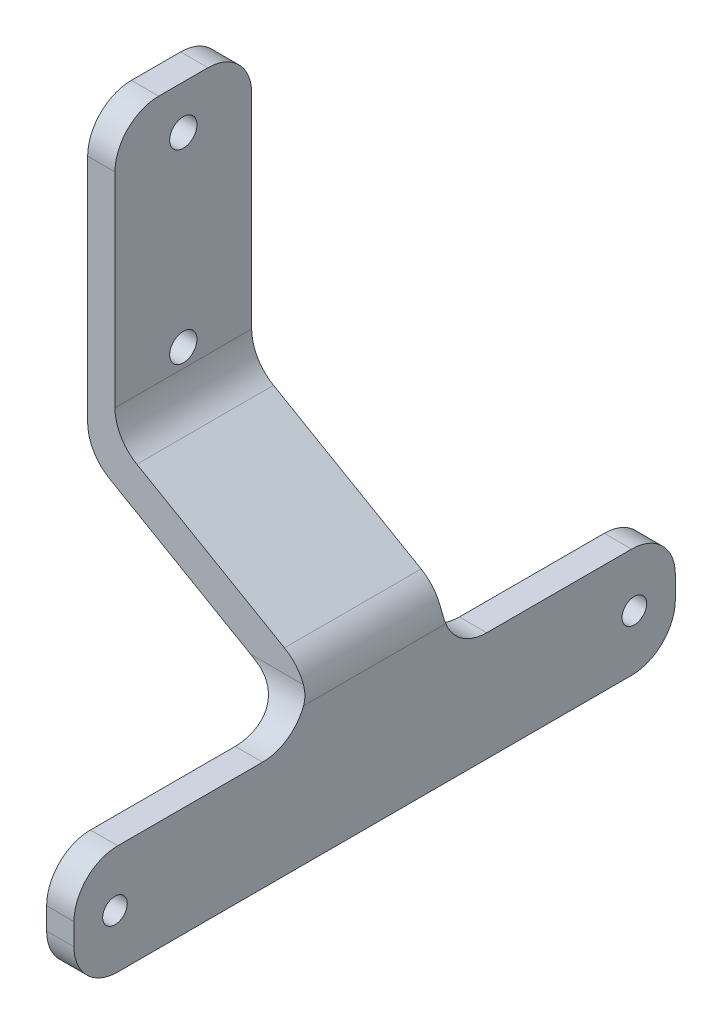
ISO-10303-21;
HEADER;
FILE_DESCRIPTION(('STEP AP214'),'2;1');
FILE_NAME('part.step','',(''),(''),'','','');
FILE_SCHEMA(('AUTOMOTIVE_DESIGN { 1 0 10303 214 1 1 1 1 }'));
ENDSEC;
DATA;
#1=APPLICATION_CONTEXT('core data for automotive mechanical design processes');
#2=APPLICATION_PROTOCOL_DEFINITION('international standard','automotive_design',2000,#1);
#3=PRODUCT_CONTEXT('',#1,'mechanical');
#4=PRODUCT('Part','Part','',(#3));
#5=PRODUCT_RELATED_PRODUCT_CATEGORY('part','',(#4));
#6=PRODUCT_DEFINITION_FORMATION('','',#4);
#7=PRODUCT_DEFINITION_CONTEXT('part definition',#1,'design');
#8=PRODUCT_DEFINITION('design','',#6,#7);
#9=PRODUCT_DEFINITION_SHAPE('','',#8);
#10=(LENGTH_UNIT() NAMED_UNIT(*) SI_UNIT(.MILLI.,.METRE.));
#11=(NAMED_UNIT(*) PLANE_ANGLE_UNIT() SI_UNIT($,.RADIAN.));
#12=(NAMED_UNIT(*) SI_UNIT($,.STERADIAN.) SOLID_ANGLE_UNIT());
#13=UNCERTAINTY_MEASURE_WITH_UNIT(LENGTH_MEASURE(1.E-05),#10,'distance_accuracy_value','');
#14=(GEOMETRIC_REPRESENTATION_CONTEXT(3) GLOBAL_UNCERTAINTY_ASSIGNED_CONTEXT((#13)) GLOBAL_UNIT_ASSIGNED_CONTEXT((#10,
#11,#12)) REPRESENTATION_CONTEXT('',''));
#15=CARTESIAN_POINT('',(0.,0.,0.));
#16=DIRECTION('',(0.,0.,1.));
#17=DIRECTION('',(1.,0.,0.));
#18=AXIS2_PLACEMENT_3D('',#15,#16,#17);
#19=CARTESIAN_POINT('',(0.,0.,12.5));
#20=DIRECTION('',(0.,0.,-1.));
#21=DIRECTION('',(-1.,0.,0.));
#22=AXIS2_PLACEMENT_3D('',#19,#20,#21);
#23=PLANE('',#22);
#24=DIRECTION('',(0.866025403784439,-0.5,0.));
#25=VECTOR('',#24,1.);
#26=CARTESIAN_POINT('',(-5.,20.2072594216369,12.5));
#27=LINE('',#26,#25);
#28=CARTESIAN_POINT('',(-0.999999999999999,17.8978583448784,12.5));
#29=VERTEX_POINT('',#28);
#30=CARTESIAN_POINT('',(24.8038475772934,3.,12.5));
#31=VERTEX_POINT('',#30);
#32=EDGE_CURVE('E251',#29,#31,#27,.T.);
#33=ORIENTED_EDGE('',*,*,#32,.T.);
#34=DIRECTION('',(-1.,0.,0.));
#35=VECTOR('',#34,1.);
#36=CARTESIAN_POINT('',(0.,3.,12.5));
#37=LINE('',#36,#35);
#38=CARTESIAN_POINT('',(34.4842084400048,3.,12.5));
#39=VERTEX_POINT('',#38);
#40=EDGE_CURVE('E384',#31,#39,#37,.F.);
#41=ORIENTED_EDGE('',*,*,#40,.T.);
#42=CARTESIAN_POINT('',(27.,0.173938424846084,12.5));
#43=DIRECTION('',(0.,0.,-1.));
#44=DIRECTION('',(-1.,0.,0.));
#45=AXIS2_PLACEMENT_3D('',#42,#43,#44);
#46=CIRCLE('',#45,8.);
#47=CARTESIAN_POINT('',(31.,7.10214165512159,12.5));
#48=VERTEX_POINT('',#47);
#49=EDGE_CURVE('E320',#39,#48,#46,.F.);
#50=ORIENTED_EDGE('',*,*,#49,.T.);
#51=DIRECTION('',(-0.866025403784439,0.5,0.));
#52=VECTOR('',#51,1.);
#53=CARTESIAN_POINT('',(35.,4.79274057836309,12.5));
#54=LINE('',#53,#52);
#55=CARTESIAN_POINT('',(4.,22.6905989232415,12.5));
#56=VERTEX_POINT('',#55);
#57=EDGE_CURVE('E247',#48,#56,#54,.T.);
#58=ORIENTED_EDGE('',*,*,#57,.T.);
#59=CARTESIAN_POINT('',(8.,29.618802153517,12.5));
#60=DIRECTION('',(0.,0.,-1.));
#61=DIRECTION('',(-1.,0.,0.));
#62=AXIS2_PLACEMENT_3D('',#59,#60,#61);
#63=CIRCLE('',#62,8.);
#64=CARTESIAN_POINT('',(0.,29.618802153517,12.5));
#65=VERTEX_POINT('',#64);
#66=EDGE_CURVE('E370',#56,#65,#63,.T.);
#67=ORIENTED_EDGE('',*,*,#66,.T.);
#68=DIRECTION('',(0.,1.,0.));
#69=VECTOR('',#68,1.);
#70=CARTESIAN_POINT('',(0.,0.,12.5));
#71=LINE('',#70,#69);
#72=CARTESIAN_POINT('',(0.,67.,12.5));
#73=VERTEX_POINT('',#72);
#74=EDGE_CURVE('E491',#65,#73,#71,.T.);
#75=ORIENTED_EDGE('',*,*,#74,.T.);
#76=DIRECTION('',(1.,0.,0.));
#77=VECTOR('',#76,1.);
#78=CARTESIAN_POINT('',(-5.,67.,12.5));
#79=LINE('',#78,#77);
#80=CARTESIAN_POINT('',(-5.,67.,12.5));
#81=VERTEX_POINT('',#80);
#82=EDGE_CURVE('E314',#73,#81,#79,.F.);
#83=ORIENTED_EDGE('',*,*,#82,.T.);
#84=DIRECTION('',(0.,1.,0.));
#85=VECTOR('',#84,1.);
#86=CARTESIAN_POINT('',(-5.,0.,12.5));
#87=LINE('',#86,#85);
#88=CARTESIAN_POINT('',(-5.,24.8260615751539,12.5));
#89=VERTEX_POINT('',#88);
#90=EDGE_CURVE('E465',#89,#81,#87,.T.);
#91=ORIENTED_EDGE('',*,*,#90,.F.);
#92=CARTESIAN_POINT('',(3.,24.8260615751539,12.5));
#93=DIRECTION('',(0.,0.,-1.));
#94=DIRECTION('',(-1.,0.,0.));
#95=AXIS2_PLACEMENT_3D('',#92,#93,#94);
#96=CIRCLE('',#95,8.);
#97=EDGE_CURVE('E317',#89,#29,#96,.F.);
#98=ORIENTED_EDGE('',*,*,#97,.T.);
#99=EDGE_LOOP('',(#33,#41,#50,#58,#67,#75,#83,#91,#98));
#100=FACE_BOUND('',#99,.T.);
#101=ADVANCED_FACE('F43',(#100),#23,.F.);
#102=CARTESIAN_POINT('',(0.,0.,-12.5));
#103=DIRECTION('',(0.,0.,-1.));
#104=DIRECTION('',(-1.,0.,0.));
#105=AXIS2_PLACEMENT_3D('',#102,#103,#104);
#106=PLANE('',#105);
#107=CARTESIAN_POINT('',(27.,0.173938424846084,-12.5));
#108=DIRECTION('',(0.,0.,-1.));
#109=DIRECTION('',(-1.,0.,0.));
#110=AXIS2_PLACEMENT_3D('',#107,#108,#109);
#111=CIRCLE('',#110,8.);
#112=CARTESIAN_POINT('',(31.,7.10214165512159,-12.5));
#113=VERTEX_POINT('',#112);
#114=CARTESIAN_POINT('',(34.4842084400048,3.,-12.5));
#115=VERTEX_POINT('',#114);
#116=EDGE_CURVE('E336',#113,#115,#111,.T.);
#117=ORIENTED_EDGE('',*,*,#116,.T.);
#118=DIRECTION('',(-1.,0.,0.));
#119=VECTOR('',#118,1.);
#120=CARTESIAN_POINT('',(30.,3.,-12.5));
#121=LINE('',#120,#119);
#122=CARTESIAN_POINT('',(24.8038475772934,3.,-12.5));
#123=VERTEX_POINT('',#122);
#124=EDGE_CURVE('E373',#115,#123,#121,.T.);
#125=ORIENTED_EDGE('',*,*,#124,.T.);
#126=DIRECTION('',(-0.866025403784439,0.5,0.));
#127=VECTOR('',#126,1.);
#128=CARTESIAN_POINT('',(7.50000000000001,12.9903810567666,-12.5));
#129=LINE('',#128,#127);
#130=CARTESIAN_POINT('',(-0.999999999999999,17.8978583448784,-12.5));
#131=VERTEX_POINT('',#130);
#132=EDGE_CURVE('E260',#123,#131,#129,.T.);
#133=ORIENTED_EDGE('',*,*,#132,.T.);
#134=CARTESIAN_POINT('',(3.,24.8260615751539,-12.5));
#135=DIRECTION('',(0.,0.,-1.));
#136=DIRECTION('',(-1.,0.,0.));
#137=AXIS2_PLACEMENT_3D('',#134,#135,#136);
#138=CIRCLE('',#137,8.);
#139=CARTESIAN_POINT('',(-5.,24.8260615751539,-12.5));
#140=VERTEX_POINT('',#139);
#141=EDGE_CURVE('E333',#131,#140,#138,.T.);
#142=ORIENTED_EDGE('',*,*,#141,.T.);
#143=DIRECTION('',(0.,1.,0.));
#144=VECTOR('',#143,1.);
#145=CARTESIAN_POINT('',(-5.,0.,-12.5));
#146=LINE('',#145,#144);
#147=CARTESIAN_POINT('',(-5.,67.,-12.5));
#148=VERTEX_POINT('',#147);
#149=EDGE_CURVE('E474',#140,#148,#146,.T.);
#150=ORIENTED_EDGE('',*,*,#149,.T.);
#151=DIRECTION('',(1.,0.,0.));
#152=VECTOR('',#151,1.);
#153=CARTESIAN_POINT('',(0.,67.,-12.5));
#154=LINE('',#153,#152);
#155=CARTESIAN_POINT('',(0.,67.,-12.5));
#156=VERTEX_POINT('',#155);
#157=EDGE_CURVE('E329',#148,#156,#154,.T.);
#158=ORIENTED_EDGE('',*,*,#157,.T.);
#159=DIRECTION('',(0.,1.,0.));
#160=VECTOR('',#159,1.);
#161=CARTESIAN_POINT('',(0.,0.,-12.5));
#162=LINE('',#161,#160);
#163=CARTESIAN_POINT('',(0.,29.618802153517,-12.5));
#164=VERTEX_POINT('',#163);
#165=EDGE_CURVE('E496',#164,#156,#162,.T.);
#166=ORIENTED_EDGE('',*,*,#165,.F.);
#167=CARTESIAN_POINT('',(8.,29.618802153517,-12.5));
#168=DIRECTION('',(0.,0.,-1.));
#169=DIRECTION('',(-1.,0.,0.));
#170=AXIS2_PLACEMENT_3D('',#167,#168,#169);
#171=CIRCLE('',#170,8.);
#172=CARTESIAN_POINT('',(4.,22.6905989232415,-12.5));
#173=VERTEX_POINT('',#172);
#174=EDGE_CURVE('E367',#164,#173,#171,.F.);
#175=ORIENTED_EDGE('',*,*,#174,.T.);
#176=DIRECTION('',(0.866025403784439,-0.5,0.));
#177=VECTOR('',#176,1.);
#178=CARTESIAN_POINT('',(10.8253175473055,18.75,-12.5));
#179=LINE('',#178,#177);
#180=EDGE_CURVE('E256',#173,#113,#179,.T.);
#181=ORIENTED_EDGE('',*,*,#180,.T.);
#182=EDGE_LOOP('',(#117,#125,#133,#142,#150,#158,#166,#175,#181));
#183=FACE_BOUND('',#182,.T.);
#184=ADVANCED_FACE('F630',(#183),#106,.T.);
#185=CARTESIAN_POINT('',(30.,0.,0.));
#186=DIRECTION('',(1.,0.,0.));
#187=DIRECTION('',(0.,0.,-1.));
#188=AXIS2_PLACEMENT_3D('',#185,#186,#187);
#189=PLANE('',#188);
#190=CARTESIAN_POINT('',(30.,-15.,47.5));
#191=DIRECTION('',(1.,0.,0.));
#192=DIRECTION('',(0.,0.,-1.));
#193=AXIS2_PLACEMENT_3D('',#190,#191,#192);
#194=CIRCLE('',#193,2.25);
#195=CARTESIAN_POINT('',(30.,-15.,45.25));
#196=VERTEX_POINT('',#195);
#197=EDGE_CURVE('E492',#196,#196,#194,.T.);
#198=ORIENTED_EDGE('',*,*,#197,.T.);
#199=EDGE_LOOP('',(#198));
#200=FACE_BOUND('',#199,.T.);
#201=CARTESIAN_POINT('',(30.,-15.,-47.5));
#202=DIRECTION('',(1.,0.,0.));
#203=DIRECTION('',(0.,0.,-1.));
#204=AXIS2_PLACEMENT_3D('',#201,#202,#203);
#205=CIRCLE('',#204,2.25);
#206=CARTESIAN_POINT('',(30.,-15.,-49.75));
#207=VERTEX_POINT('',#206);
#208=EDGE_CURVE('E575',#207,#207,#205,.T.);
#209=ORIENTED_EDGE('',*,*,#208,.T.);
#210=EDGE_LOOP('',(#209));
#211=FACE_BOUND('',#210,.T.);
#212=DIRECTION('',(0.,0.,-1.));
#213=VECTOR('',#212,1.);
#214=CARTESIAN_POINT('',(30.,-25.,0.));
#215=LINE('',#214,#213);
#216=CARTESIAN_POINT('',(30.,-25.,47.));
#217=VERTEX_POINT('',#216);
#218=CARTESIAN_POINT('',(30.,-25.,-47.));
#219=VERTEX_POINT('',#218);
#220=EDGE_CURVE('E223',#217,#219,#215,.T.);
#221=ORIENTED_EDGE('',*,*,#220,.F.);
#222=CARTESIAN_POINT('',(30.,-17.,47.));
#223=DIRECTION('',(1.,0.,0.));
#224=DIRECTION('',(0.,0.,-1.));
#225=AXIS2_PLACEMENT_3D('',#222,#223,#224);
#226=CIRCLE('',#225,8.);
#227=CARTESIAN_POINT('',(30.,-17.,55.));
#228=VERTEX_POINT('',#227);
#229=EDGE_CURVE('E205',#217,#228,#226,.F.);
#230=ORIENTED_EDGE('',*,*,#229,.T.);
#231=DIRECTION('',(0.,1.,0.));
#232=VECTOR('',#231,1.);
#233=CARTESIAN_POINT('',(30.,0.,55.));
#234=LINE('',#233,#232);
#235=CARTESIAN_POINT('',(30.,-13.,55.));
#236=VERTEX_POINT('',#235);
#237=EDGE_CURVE('E236',#228,#236,#234,.T.);
#238=ORIENTED_EDGE('',*,*,#237,.T.);
#239=CARTESIAN_POINT('',(30.,-13.,47.));
#240=DIRECTION('',(1.,0.,0.));
#241=DIRECTION('',(0.,0.,-1.));
#242=AXIS2_PLACEMENT_3D('',#239,#240,#241);
#243=CIRCLE('',#242,8.);
#244=CARTESIAN_POINT('',(30.,-5.,47.));
#245=VERTEX_POINT('',#244);
#246=EDGE_CURVE('E217',#236,#245,#243,.F.);
#247=ORIENTED_EDGE('',*,*,#246,.T.);
#248=DIRECTION('',(0.,0.,-1.));
#249=VECTOR('',#248,1.);
#250=CARTESIAN_POINT('',(30.,-5.,0.));
#251=LINE('',#250,#249);
#252=CARTESIAN_POINT('',(30.,-5.,20.5));
#253=VERTEX_POINT('',#252);
#254=EDGE_CURVE('E243',#245,#253,#251,.T.);
#255=ORIENTED_EDGE('',*,*,#254,.T.);
#256=CARTESIAN_POINT('',(30.,3.,20.5));
#257=DIRECTION('',(1.,0.,0.));
#258=DIRECTION('',(0.,0.,-1.));
#259=AXIS2_PLACEMENT_3D('',#256,#257,#258);
#260=CIRCLE('',#259,8.);
#261=CARTESIAN_POINT('',(30.,-4.618802153517,18.0599480035098));
#262=VERTEX_POINT('',#261);
#263=EDGE_CURVE('E421',#253,#262,#260,.T.);
#264=ORIENTED_EDGE('',*,*,#263,.T.);
#265=DIRECTION('',(0.,0.,-1.));
#266=VECTOR('',#265,1.);
#267=CARTESIAN_POINT('',(30.,-4.618802153517,0.));
#268=LINE('',#267,#266);
#269=CARTESIAN_POINT('',(30.,-4.618802153517,-18.0599480035098));
#270=VERTEX_POINT('',#269);
#271=EDGE_CURVE('E228',#262,#270,#268,.T.);
#272=ORIENTED_EDGE('',*,*,#271,.T.);
#273=CARTESIAN_POINT('',(30.,3.,-20.5));
#274=DIRECTION('',(1.,0.,0.));
#275=DIRECTION('',(0.,0.,-1.));
#276=AXIS2_PLACEMENT_3D('',#273,#274,#275);
#277=CIRCLE('',#276,8.);
#278=CARTESIAN_POINT('',(30.,-5.,-20.5));
#279=VERTEX_POINT('',#278);
#280=EDGE_CURVE('E399',#270,#279,#277,.T.);
#281=ORIENTED_EDGE('',*,*,#280,.T.);
#282=CARTESIAN_POINT('',(30.,-5.,-47.));
#283=VERTEX_POINT('',#282);
#284=EDGE_CURVE('E241',#279,#283,#251,.T.);
#285=ORIENTED_EDGE('',*,*,#284,.T.);
#286=CARTESIAN_POINT('',(30.,-13.,-47.));
#287=DIRECTION('',(1.,0.,0.));
#288=DIRECTION('',(0.,0.,-1.));
#289=AXIS2_PLACEMENT_3D('',#286,#287,#288);
#290=CIRCLE('',#289,8.);
#291=CARTESIAN_POINT('',(30.,-13.,-55.));
#292=VERTEX_POINT('',#291);
#293=EDGE_CURVE('E267',#283,#292,#290,.F.);
#294=ORIENTED_EDGE('',*,*,#293,.T.);
#295=DIRECTION('',(0.,1.,0.));
#296=VECTOR('',#295,1.);
#297=CARTESIAN_POINT('',(30.,0.,-55.));
#298=LINE('',#297,#296);
#299=CARTESIAN_POINT('',(30.,-17.,-55.));
#300=VERTEX_POINT('',#299);
#301=EDGE_CURVE('E235',#300,#292,#298,.T.);
#302=ORIENTED_EDGE('',*,*,#301,.F.);
#303=CARTESIAN_POINT('',(30.,-17.,-47.));
#304=DIRECTION('',(1.,0.,0.));
#305=DIRECTION('',(0.,0.,-1.));
#306=AXIS2_PLACEMENT_3D('',#303,#304,#305);
#307=CIRCLE('',#306,8.);
#308=EDGE_CURVE('E233',#300,#219,#307,.F.);
#309=ORIENTED_EDGE('',*,*,#308,.T.);
#310=EDGE_LOOP('',(#221,#230,#238,#247,#255,#264,#272,#281,#285,#294,#302,#309));
#311=FACE_BOUND('',#310,.T.);
#312=ADVANCED_FACE('F231',(#200,#211,#311),#189,.F.);
#313=CARTESIAN_POINT('',(35.,-5.,0.));
#314=DIRECTION('',(0.,1.,0.));
#315=DIRECTION('',(0.,0.,1.));
#316=AXIS2_PLACEMENT_3D('',#313,#314,#315);
#317=PLANE('',#316);
#318=DIRECTION('',(0.,0.,-1.));
#319=VECTOR('',#318,1.);
#320=CARTESIAN_POINT('',(35.,-5.,0.));
#321=LINE('',#320,#319);
#322=CARTESIAN_POINT('',(35.,-5.,47.));
#323=VERTEX_POINT('',#322);
#324=CARTESIAN_POINT('',(35.,-5.,20.5));
#325=VERTEX_POINT('',#324);
#326=EDGE_CURVE('E500',#323,#325,#321,.T.);
#327=ORIENTED_EDGE('',*,*,#326,.T.);
#328=DIRECTION('',(-1.,0.,0.));
#329=VECTOR('',#328,1.);
#330=CARTESIAN_POINT('',(35.,-5.,20.5));
#331=LINE('',#330,#329);
#332=EDGE_CURVE('E380',#325,#253,#331,.T.);
#333=ORIENTED_EDGE('',*,*,#332,.T.);
#334=ORIENTED_EDGE('',*,*,#254,.F.);
#335=DIRECTION('',(-1.,0.,0.));
#336=VECTOR('',#335,1.);
#337=CARTESIAN_POINT('',(35.,-5.,47.));
#338=LINE('',#337,#336);
#339=EDGE_CURVE('E294',#245,#323,#338,.F.);
#340=ORIENTED_EDGE('',*,*,#339,.T.);
#341=EDGE_LOOP('',(#327,#333,#334,#340));
#342=FACE_BOUND('',#341,.T.);
#343=ADVANCED_FACE('F544',(#342),#317,.T.);
#344=CARTESIAN_POINT('',(35.,0.,55.));
#345=DIRECTION('',(0.,0.,1.));
#346=DIRECTION('',(1.,0.,0.));
#347=AXIS2_PLACEMENT_3D('',#344,#345,#346);
#348=PLANE('',#347);
#349=ORIENTED_EDGE('',*,*,#237,.F.);
#350=DIRECTION('',(-1.,0.,0.));
#351=VECTOR('',#350,1.);
#352=CARTESIAN_POINT('',(35.,-17.,55.));
#353=LINE('',#352,#351);
#354=CARTESIAN_POINT('',(35.,-17.,55.));
#355=VERTEX_POINT('',#354);
#356=EDGE_CURVE('E210',#228,#355,#353,.F.);
#357=ORIENTED_EDGE('',*,*,#356,.T.);
#358=DIRECTION('',(0.,1.,0.));
#359=VECTOR('',#358,1.);
#360=CARTESIAN_POINT('',(35.,0.,55.));
#361=LINE('',#360,#359);
#362=CARTESIAN_POINT('',(35.,-13.,55.));
#363=VERTEX_POINT('',#362);
#364=EDGE_CURVE('E504',#355,#363,#361,.T.);
#365=ORIENTED_EDGE('',*,*,#364,.T.);
#366=DIRECTION('',(-1.,0.,0.));
#367=VECTOR('',#366,1.);
#368=CARTESIAN_POINT('',(35.,-13.,55.));
#369=LINE('',#368,#367);
#370=EDGE_CURVE('E216',#363,#236,#369,.T.);
#371=ORIENTED_EDGE('',*,*,#370,.T.);
#372=EDGE_LOOP('',(#349,#357,#365,#371));
#373=FACE_BOUND('',#372,.T.);
#374=ADVANCED_FACE('F539',(#373),#348,.T.);
#375=CARTESIAN_POINT('',(35.,-25.,0.));
#376=DIRECTION('',(0.,1.,0.));
#377=DIRECTION('',(0.,0.,1.));
#378=AXIS2_PLACEMENT_3D('',#375,#376,#377);
#379=PLANE('',#378);
#380=DIRECTION('',(0.,0.,-1.));
#381=VECTOR('',#380,1.);
#382=CARTESIAN_POINT('',(35.,-25.,0.));
#383=LINE('',#382,#381);
#384=CARTESIAN_POINT('',(35.,-25.,47.));
#385=VERTEX_POINT('',#384);
#386=CARTESIAN_POINT('',(35.,-25.,-47.));
#387=VERTEX_POINT('',#386);
#388=EDGE_CURVE('E226',#385,#387,#383,.T.);
#389=ORIENTED_EDGE('',*,*,#388,.F.);
#390=DIRECTION('',(-1.,0.,0.));
#391=VECTOR('',#390,1.);
#392=CARTESIAN_POINT('',(30.,-25.,47.));
#393=LINE('',#392,#391);
#394=EDGE_CURVE('E209',#385,#217,#393,.T.);
#395=ORIENTED_EDGE('',*,*,#394,.T.);
#396=ORIENTED_EDGE('',*,*,#220,.T.);
#397=DIRECTION('',(-1.,0.,0.));
#398=VECTOR('',#397,1.);
#399=CARTESIAN_POINT('',(35.,-25.,-47.));
#400=LINE('',#399,#398);
#401=EDGE_CURVE('E229',#219,#387,#400,.F.);
#402=ORIENTED_EDGE('',*,*,#401,.T.);
#403=EDGE_LOOP('',(#389,#395,#396,#402));
#404=FACE_BOUND('',#403,.T.);
#405=ADVANCED_FACE('F222',(#404),#379,.F.);
#406=CARTESIAN_POINT('',(35.,0.,-55.));
#407=DIRECTION('',(0.,0.,1.));
#408=DIRECTION('',(1.,0.,0.));
#409=AXIS2_PLACEMENT_3D('',#406,#407,#408);
#410=PLANE('',#409);
#411=DIRECTION('',(0.,1.,0.));
#412=VECTOR('',#411,1.);
#413=CARTESIAN_POINT('',(35.,0.,-55.));
#414=LINE('',#413,#412);
#415=CARTESIAN_POINT('',(35.,-17.,-55.));
#416=VERTEX_POINT('',#415);
#417=CARTESIAN_POINT('',(35.,-13.,-55.));
#418=VERTEX_POINT('',#417);
#419=EDGE_CURVE('E510',#416,#418,#414,.T.);
#420=ORIENTED_EDGE('',*,*,#419,.F.);
#421=DIRECTION('',(-1.,0.,0.));
#422=VECTOR('',#421,1.);
#423=CARTESIAN_POINT('',(35.,-17.,-55.));
#424=LINE('',#423,#422);
#425=EDGE_CURVE('E300',#416,#300,#424,.T.);
#426=ORIENTED_EDGE('',*,*,#425,.T.);
#427=ORIENTED_EDGE('',*,*,#301,.T.);
#428=DIRECTION('',(-1.,0.,0.));
#429=VECTOR('',#428,1.);
#430=CARTESIAN_POINT('',(35.,-13.,-55.));
#431=LINE('',#430,#429);
#432=EDGE_CURVE('E297',#292,#418,#431,.F.);
#433=ORIENTED_EDGE('',*,*,#432,.T.);
#434=EDGE_LOOP('',(#420,#426,#427,#433));
#435=FACE_BOUND('',#434,.T.);
#436=ADVANCED_FACE('F530',(#435),#410,.F.);
#437=ORIENTED_EDGE('',*,*,#284,.F.);
#438=DIRECTION('',(-1.,0.,0.));
#439=VECTOR('',#438,1.);
#440=CARTESIAN_POINT('',(35.,-5.,-20.5));
#441=LINE('',#440,#439);
#442=CARTESIAN_POINT('',(35.,-5.,-20.5));
#443=VERTEX_POINT('',#442);
#444=EDGE_CURVE('E377',#279,#443,#441,.F.);
#445=ORIENTED_EDGE('',*,*,#444,.T.);
#446=CARTESIAN_POINT('',(35.,-5.,-47.));
#447=VERTEX_POINT('',#446);
#448=EDGE_CURVE('E252',#443,#447,#321,.T.);
#449=ORIENTED_EDGE('',*,*,#448,.T.);
#450=DIRECTION('',(-1.,0.,0.));
#451=VECTOR('',#450,1.);
#452=CARTESIAN_POINT('',(30.,-5.,-47.));
#453=LINE('',#452,#451);
#454=EDGE_CURVE('E304',#447,#283,#453,.T.);
#455=ORIENTED_EDGE('',*,*,#454,.T.);
#456=EDGE_LOOP('',(#437,#445,#449,#455));
#457=FACE_BOUND('',#456,.T.);
#458=ADVANCED_FACE('F519',(#457),#317,.T.);
#459=CARTESIAN_POINT('',(35.,0.,0.));
#460=DIRECTION('',(1.,0.,0.));
#461=DIRECTION('',(0.,0.,-1.));
#462=AXIS2_PLACEMENT_3D('',#459,#460,#461);
#463=PLANE('',#462);
#464=CARTESIAN_POINT('',(35.,-15.,47.5));
#465=DIRECTION('',(1.,0.,0.));
#466=DIRECTION('',(0.,0.,-1.));
#467=AXIS2_PLACEMENT_3D('',#464,#465,#466);
#468=CIRCLE('',#467,2.25);
#469=CARTESIAN_POINT('',(35.,-15.,45.25));
#470=VERTEX_POINT('',#469);
#471=EDGE_CURVE('E579',#470,#470,#468,.T.);
#472=ORIENTED_EDGE('',*,*,#471,.F.);
#473=EDGE_LOOP('',(#472));
#474=FACE_BOUND('',#473,.T.);
#475=CARTESIAN_POINT('',(35.,-15.,-47.5));
#476=DIRECTION('',(1.,0.,0.));
#477=DIRECTION('',(0.,0.,-1.));
#478=AXIS2_PLACEMENT_3D('',#475,#476,#477);
#479=CIRCLE('',#478,2.25);
#480=CARTESIAN_POINT('',(35.,-15.,-49.75));
#481=VERTEX_POINT('',#480);
#482=EDGE_CURVE('E580',#481,#481,#479,.T.);
#483=ORIENTED_EDGE('',*,*,#482,.F.);
#484=EDGE_LOOP('',(#483));
#485=FACE_BOUND('',#484,.T.);
#486=ORIENTED_EDGE('',*,*,#364,.F.);
#487=CARTESIAN_POINT('',(35.,-17.,47.));
#488=DIRECTION('',(1.,0.,0.));
#489=DIRECTION('',(0.,0.,-1.));
#490=AXIS2_PLACEMENT_3D('',#487,#488,#489);
#491=CIRCLE('',#490,8.);
#492=EDGE_CURVE('E291',#355,#385,#491,.T.);
#493=ORIENTED_EDGE('',*,*,#492,.T.);
#494=ORIENTED_EDGE('',*,*,#388,.T.);
#495=CARTESIAN_POINT('',(35.,-17.,-47.));
#496=DIRECTION('',(1.,0.,0.));
#497=DIRECTION('',(0.,0.,-1.));
#498=AXIS2_PLACEMENT_3D('',#495,#496,#497);
#499=CIRCLE('',#498,8.);
#500=EDGE_CURVE('E285',#387,#416,#499,.T.);
#501=ORIENTED_EDGE('',*,*,#500,.T.);
#502=ORIENTED_EDGE('',*,*,#419,.T.);
#503=CARTESIAN_POINT('',(35.,-13.,-47.));
#504=DIRECTION('',(1.,0.,0.));
#505=DIRECTION('',(0.,0.,-1.));
#506=AXIS2_PLACEMENT_3D('',#503,#504,#505);
#507=CIRCLE('',#506,8.);
#508=EDGE_CURVE('E281',#418,#447,#507,.T.);
#509=ORIENTED_EDGE('',*,*,#508,.T.);
#510=ORIENTED_EDGE('',*,*,#448,.F.);
#511=CARTESIAN_POINT('',(35.,3.,-20.5));
#512=DIRECTION('',(1.,0.,0.));
#513=DIRECTION('',(0.,0.,-1.));
#514=AXIS2_PLACEMENT_3D('',#511,#512,#513);
#515=CIRCLE('',#514,8.);
#516=CARTESIAN_POINT('',(35.,0.173938424846084,-13.0157915599952));
#517=VERTEX_POINT('',#516);
#518=EDGE_CURVE('E422',#443,#517,#515,.F.);
#519=ORIENTED_EDGE('',*,*,#518,.T.);
#520=DIRECTION('',(0.,0.,1.));
#521=VECTOR('',#520,1.);
#522=CARTESIAN_POINT('',(35.,0.173938424846084,0.));
#523=LINE('',#522,#521);
#524=CARTESIAN_POINT('',(35.,0.173938424846084,13.0157915599952));
#525=VERTEX_POINT('',#524);
#526=EDGE_CURVE('E59',#517,#525,#523,.T.);
#527=ORIENTED_EDGE('',*,*,#526,.T.);
#528=CARTESIAN_POINT('',(35.,3.,20.5));
#529=DIRECTION('',(1.,0.,0.));
#530=DIRECTION('',(0.,0.,-1.));
#531=AXIS2_PLACEMENT_3D('',#528,#529,#530);
#532=CIRCLE('',#531,8.);
#533=EDGE_CURVE('E11',#525,#325,#532,.F.);
#534=ORIENTED_EDGE('',*,*,#533,.T.);
#535=ORIENTED_EDGE('',*,*,#326,.F.);
#536=CARTESIAN_POINT('',(35.,-13.,47.));
#537=DIRECTION('',(1.,0.,0.));
#538=DIRECTION('',(0.,0.,-1.));
#539=AXIS2_PLACEMENT_3D('',#536,#537,#538);
#540=CIRCLE('',#539,8.);
#541=EDGE_CURVE('E288',#323,#363,#540,.T.);
#542=ORIENTED_EDGE('',*,*,#541,.T.);
#543=EDGE_LOOP('',(#486,#493,#494,#501,#502,#509,#510,#519,#527,#534,#535,#542));
#544=FACE_BOUND('',#543,.T.);
#545=ADVANCED_FACE('F524',(#474,#485,#544),#463,.T.);
#546=CARTESIAN_POINT('',(0.,0.,0.));
#547=DIRECTION('',(-1.,0.,0.));
#548=DIRECTION('',(0.,0.,1.));
#549=AXIS2_PLACEMENT_3D('',#546,#547,#548);
#550=PLANE('',#549);
#551=CARTESIAN_POINT('',(0.,67.,0.));
#552=DIRECTION('',(1.,0.,0.));
#553=DIRECTION('',(0.,0.,-1.));
#554=AXIS2_PLACEMENT_3D('',#551,#552,#553);
#555=CIRCLE('',#554,2.5);
#556=CARTESIAN_POINT('',(0.,67.,-2.5));
#557=VERTEX_POINT('',#556);
#558=EDGE_CURVE('E596',#557,#557,#555,.T.);
#559=ORIENTED_EDGE('',*,*,#558,.F.);
#560=EDGE_LOOP('',(#559));
#561=FACE_BOUND('',#560,.T.);
#562=CARTESIAN_POINT('',(0.,33.,0.));
#563=DIRECTION('',(1.,0.,0.));
#564=DIRECTION('',(0.,0.,-1.));
#565=AXIS2_PLACEMENT_3D('',#562,#563,#564);
#566=CIRCLE('',#565,2.5);
#567=CARTESIAN_POINT('',(0.,33.,-2.5));
#568=VERTEX_POINT('',#567);
#569=EDGE_CURVE('E588',#568,#568,#566,.T.);
#570=ORIENTED_EDGE('',*,*,#569,.F.);
#571=EDGE_LOOP('',(#570));
#572=FACE_BOUND('',#571,.T.);
#573=ORIENTED_EDGE('',*,*,#74,.F.);
#574=DIRECTION('',(0.,0.,-1.));
#575=VECTOR('',#574,1.);
#576=CARTESIAN_POINT('',(0.,29.618802153517,0.));
#577=LINE('',#576,#575);
#578=EDGE_CURVE('E356',#65,#164,#577,.T.);
#579=ORIENTED_EDGE('',*,*,#578,.T.);
#580=ORIENTED_EDGE('',*,*,#165,.T.);
#581=CARTESIAN_POINT('',(0.,67.,-4.5));
#582=DIRECTION('',(-1.,0.,0.));
#583=DIRECTION('',(0.,0.,1.));
#584=AXIS2_PLACEMENT_3D('',#581,#582,#583);
#585=CIRCLE('',#584,8.);
#586=CARTESIAN_POINT('',(0.,75.,-4.5));
#587=VERTEX_POINT('',#586);
#588=EDGE_CURVE('E350',#156,#587,#585,.F.);
#589=ORIENTED_EDGE('',*,*,#588,.T.);
#590=DIRECTION('',(0.,0.,1.));
#591=VECTOR('',#590,1.);
#592=CARTESIAN_POINT('',(0.,75.,-12.5));
#593=LINE('',#592,#591);
#594=CARTESIAN_POINT('',(0.,75.,4.5));
#595=VERTEX_POINT('',#594);
#596=EDGE_CURVE('E487',#587,#595,#593,.T.);
#597=ORIENTED_EDGE('',*,*,#596,.T.);
#598=CARTESIAN_POINT('',(0.,67.,4.5));
#599=DIRECTION('',(-1.,0.,0.));
#600=DIRECTION('',(0.,0.,1.));
#601=AXIS2_PLACEMENT_3D('',#598,#599,#600);
#602=CIRCLE('',#601,8.);
#603=EDGE_CURVE('E353',#595,#73,#602,.F.);
#604=ORIENTED_EDGE('',*,*,#603,.T.);
#605=EDGE_LOOP('',(#573,#579,#580,#589,#597,#604));
#606=FACE_BOUND('',#605,.T.);
#607=ADVANCED_FACE('F560',(#561,#572,#606),#550,.F.);
#608=CARTESIAN_POINT('',(-5.,75.,-12.5));
#609=DIRECTION('',(0.,1.,0.));
#610=DIRECTION('',(0.,0.,1.));
#611=AXIS2_PLACEMENT_3D('',#608,#609,#610);
#612=PLANE('',#611);
#613=DIRECTION('',(0.,0.,1.));
#614=VECTOR('',#613,1.);
#615=CARTESIAN_POINT('',(-5.,75.,-12.5));
#616=LINE('',#615,#614);
#617=CARTESIAN_POINT('',(-5.,75.,-4.5));
#618=VERTEX_POINT('',#617);
#619=CARTESIAN_POINT('',(-5.,75.,4.5));
#620=VERTEX_POINT('',#619);
#621=EDGE_CURVE('E483',#618,#620,#616,.T.);
#622=ORIENTED_EDGE('',*,*,#621,.T.);
#623=DIRECTION('',(1.,0.,0.));
#624=VECTOR('',#623,1.);
#625=CARTESIAN_POINT('',(0.,75.,4.5));
#626=LINE('',#625,#624);
#627=EDGE_CURVE('E363',#620,#595,#626,.T.);
#628=ORIENTED_EDGE('',*,*,#627,.T.);
#629=ORIENTED_EDGE('',*,*,#596,.F.);
#630=DIRECTION('',(1.,0.,0.));
#631=VECTOR('',#630,1.);
#632=CARTESIAN_POINT('',(-5.,75.,-4.5));
#633=LINE('',#632,#631);
#634=EDGE_CURVE('E360',#587,#618,#633,.F.);
#635=ORIENTED_EDGE('',*,*,#634,.T.);
#636=EDGE_LOOP('',(#622,#628,#629,#635));
#637=FACE_BOUND('',#636,.T.);
#638=ADVANCED_FACE('F568',(#637),#612,.T.);
#639=CARTESIAN_POINT('',(-5.,0.,0.));
#640=DIRECTION('',(-1.,0.,0.));
#641=DIRECTION('',(0.,0.,1.));
#642=AXIS2_PLACEMENT_3D('',#639,#640,#641);
#643=PLANE('',#642);
#644=CARTESIAN_POINT('',(-5.,67.,0.));
#645=DIRECTION('',(1.,0.,0.));
#646=DIRECTION('',(0.,0.,-1.));
#647=AXIS2_PLACEMENT_3D('',#644,#645,#646);
#648=CIRCLE('',#647,2.5);
#649=CARTESIAN_POINT('',(-5.,67.,-2.5));
#650=VERTEX_POINT('',#649);
#651=EDGE_CURVE('E584',#650,#650,#648,.T.);
#652=ORIENTED_EDGE('',*,*,#651,.T.);
#653=EDGE_LOOP('',(#652));
#654=FACE_BOUND('',#653,.T.);
#655=CARTESIAN_POINT('',(-5.,33.,0.));
#656=DIRECTION('',(1.,0.,0.));
#657=DIRECTION('',(0.,0.,-1.));
#658=AXIS2_PLACEMENT_3D('',#655,#656,#657);
#659=CIRCLE('',#658,2.5);
#660=CARTESIAN_POINT('',(-5.,33.,-2.5));
#661=VERTEX_POINT('',#660);
#662=EDGE_CURVE('E592',#661,#661,#659,.T.);
#663=ORIENTED_EDGE('',*,*,#662,.T.);
#664=EDGE_LOOP('',(#663));
#665=FACE_BOUND('',#664,.T.);
#666=ORIENTED_EDGE('',*,*,#149,.F.);
#667=DIRECTION('',(0.,0.,1.));
#668=VECTOR('',#667,1.);
#669=CARTESIAN_POINT('',(-5.,24.8260615751539,0.));
#670=LINE('',#669,#668);
#671=EDGE_CURVE('E346',#140,#89,#670,.T.);
#672=ORIENTED_EDGE('',*,*,#671,.T.);
#673=ORIENTED_EDGE('',*,*,#90,.T.);
#674=CARTESIAN_POINT('',(-5.,67.,4.5));
#675=DIRECTION('',(-1.,0.,0.));
#676=DIRECTION('',(0.,0.,1.));
#677=AXIS2_PLACEMENT_3D('',#674,#675,#676);
#678=CIRCLE('',#677,8.);
#679=EDGE_CURVE('E343',#81,#620,#678,.T.);
#680=ORIENTED_EDGE('',*,*,#679,.T.);
#681=ORIENTED_EDGE('',*,*,#621,.F.);
#682=CARTESIAN_POINT('',(-5.,67.,-4.5));
#683=DIRECTION('',(-1.,0.,0.));
#684=DIRECTION('',(0.,0.,1.));
#685=AXIS2_PLACEMENT_3D('',#682,#683,#684);
#686=CIRCLE('',#685,8.);
#687=EDGE_CURVE('E340',#618,#148,#686,.T.);
#688=ORIENTED_EDGE('',*,*,#687,.T.);
#689=EDGE_LOOP('',(#666,#672,#673,#680,#681,#688));
#690=FACE_BOUND('',#689,.T.);
#691=ADVANCED_FACE('F471',(#654,#665,#690),#643,.T.);
#692=CARTESIAN_POINT('',(-5.,-15.,-47.5));
#693=DIRECTION('',(1.,0.,0.));
#694=DIRECTION('',(0.,0.,-1.));
#695=AXIS2_PLACEMENT_3D('',#692,#693,#694);
#696=CYLINDRICAL_SURFACE('',#695,2.25);
#697=ORIENTED_EDGE('',*,*,#482,.T.);
#698=EDGE_LOOP('',(#697));
#699=FACE_BOUND('',#698,.T.);
#700=ORIENTED_EDGE('',*,*,#208,.F.);
#701=EDGE_LOOP('',(#700));
#702=FACE_BOUND('',#701,.T.);
#703=ADVANCED_FACE('F625',(#699,#702),#696,.F.);
#704=CARTESIAN_POINT('',(-5.,-15.,47.5));
#705=DIRECTION('',(1.,0.,0.));
#706=DIRECTION('',(0.,0.,-1.));
#707=AXIS2_PLACEMENT_3D('',#704,#705,#706);
#708=CYLINDRICAL_SURFACE('',#707,2.25);
#709=ORIENTED_EDGE('',*,*,#471,.T.);
#710=EDGE_LOOP('',(#709));
#711=FACE_BOUND('',#710,.T.);
#712=ORIENTED_EDGE('',*,*,#197,.F.);
#713=EDGE_LOOP('',(#712));
#714=FACE_BOUND('',#713,.T.);
#715=ADVANCED_FACE('F619',(#711,#714),#708,.F.);
#716=CARTESIAN_POINT('',(-5.,33.,0.));
#717=DIRECTION('',(1.,0.,0.));
#718=DIRECTION('',(0.,0.,-1.));
#719=AXIS2_PLACEMENT_3D('',#716,#717,#718);
#720=CYLINDRICAL_SURFACE('',#719,2.5);
#721=ORIENTED_EDGE('',*,*,#662,.F.);
#722=EDGE_LOOP('',(#721));
#723=FACE_BOUND('',#722,.T.);
#724=ORIENTED_EDGE('',*,*,#569,.T.);
#725=EDGE_LOOP('',(#724));
#726=FACE_BOUND('',#725,.T.);
#727=ADVANCED_FACE('F609',(#723,#726),#720,.F.);
#728=CARTESIAN_POINT('',(-5.,67.,0.));
#729=DIRECTION('',(1.,0.,0.));
#730=DIRECTION('',(0.,0.,-1.));
#731=AXIS2_PLACEMENT_3D('',#728,#729,#730);
#732=CYLINDRICAL_SURFACE('',#731,2.5);
#733=ORIENTED_EDGE('',*,*,#651,.F.);
#734=EDGE_LOOP('',(#733));
#735=FACE_BOUND('',#734,.T.);
#736=ORIENTED_EDGE('',*,*,#558,.T.);
#737=EDGE_LOOP('',(#736));
#738=FACE_BOUND('',#737,.T.);
#739=ADVANCED_FACE('F606',(#735,#738),#732,.F.);
#740=CARTESIAN_POINT('',(-5.,20.2072594216369,0.));
#741=DIRECTION('',(-0.5,-0.866025403784439,0.));
#742=DIRECTION('',(0.,0.,-1.));
#743=AXIS2_PLACEMENT_3D('',#740,#741,#742);
#744=PLANE('',#743);
#745=ORIENTED_EDGE('',*,*,#132,.F.);
#746=CARTESIAN_POINT('',(24.8038475772934,3.,-20.5));
#747=DIRECTION('',(-0.5,-0.866025403784439,0.));
#748=DIRECTION('',(0.866025403784439,-0.5,0.));
#749=AXIS2_PLACEMENT_3D('',#746,#747,#748);
#750=ELLIPSE('',#749,16.,8.);
#751=CARTESIAN_POINT('',(26.,2.3094010767585,-12.529863669471));
#752=VERTEX_POINT('',#751);
#753=EDGE_CURVE('E387',#123,#752,#750,.F.);
#754=ORIENTED_EDGE('',*,*,#753,.T.);
#755=DIRECTION('',(0.,0.,-1.));
#756=VECTOR('',#755,1.);
#757=CARTESIAN_POINT('',(26.,2.3094010767585,0.));
#758=LINE('',#757,#756);
#759=CARTESIAN_POINT('',(26.,2.3094010767585,12.529863669471));
#760=VERTEX_POINT('',#759);
#761=EDGE_CURVE('E67',#752,#760,#758,.F.);
#762=ORIENTED_EDGE('',*,*,#761,.T.);
#763=CARTESIAN_POINT('',(24.8038475772934,3.,20.5));
#764=DIRECTION('',(-0.5,-0.866025403784439,0.));
#765=DIRECTION('',(-0.866025403784439,0.5,0.));
#766=AXIS2_PLACEMENT_3D('',#763,#764,#765);
#767=ELLIPSE('',#766,16.,8.);
#768=EDGE_CURVE('E438',#760,#31,#767,.F.);
#769=ORIENTED_EDGE('',*,*,#768,.T.);
#770=ORIENTED_EDGE('',*,*,#32,.F.);
#771=DIRECTION('',(0.,0.,1.));
#772=VECTOR('',#771,1.);
#773=CARTESIAN_POINT('',(-1.,17.8978583448784,0.));
#774=LINE('',#773,#772);
#775=EDGE_CURVE('E308',#29,#131,#774,.F.);
#776=ORIENTED_EDGE('',*,*,#775,.T.);
#777=EDGE_LOOP('',(#745,#754,#762,#769,#770,#776));
#778=FACE_BOUND('',#777,.T.);
#779=ADVANCED_FACE('F459',(#778),#744,.T.);
#780=CARTESIAN_POINT('',(35.,4.79274057836309,0.));
#781=DIRECTION('',(0.5,0.866025403784439,0.));
#782=DIRECTION('',(0.,0.,-1.));
#783=AXIS2_PLACEMENT_3D('',#780,#781,#782);
#784=PLANE('',#783);
#785=ORIENTED_EDGE('',*,*,#57,.F.);
#786=DIRECTION('',(0.,0.,1.));
#787=VECTOR('',#786,1.);
#788=CARTESIAN_POINT('',(31.,7.10214165512159,0.));
#789=LINE('',#788,#787);
#790=EDGE_CURVE('E326',#48,#113,#789,.F.);
#791=ORIENTED_EDGE('',*,*,#790,.T.);
#792=ORIENTED_EDGE('',*,*,#180,.F.);
#793=DIRECTION('',(0.,0.,-1.));
#794=VECTOR('',#793,1.);
#795=CARTESIAN_POINT('',(4.,22.6905989232415,0.));
#796=LINE('',#795,#794);
#797=EDGE_CURVE('E323',#173,#56,#796,.F.);
#798=ORIENTED_EDGE('',*,*,#797,.T.);
#799=EDGE_LOOP('',(#785,#791,#792,#798));
#800=FACE_BOUND('',#799,.T.);
#801=ADVANCED_FACE('F551',(#800),#784,.T.);
#802=CARTESIAN_POINT('',(35.,-17.,47.));
#803=DIRECTION('',(1.,0.,0.));
#804=DIRECTION('',(0.,0.,-1.));
#805=AXIS2_PLACEMENT_3D('',#802,#803,#804);
#806=CYLINDRICAL_SURFACE('',#805,8.);
#807=ORIENTED_EDGE('',*,*,#492,.F.);
#808=ORIENTED_EDGE('',*,*,#356,.F.);
#809=ORIENTED_EDGE('',*,*,#229,.F.);
#810=ORIENTED_EDGE('',*,*,#394,.F.);
#811=EDGE_LOOP('',(#807,#808,#809,#810));
#812=FACE_BOUND('',#811,.T.);
#813=ADVANCED_FACE('F208',(#812),#806,.T.);
#814=CARTESIAN_POINT('',(35.,-13.,47.));
#815=DIRECTION('',(-1.,0.,0.));
#816=DIRECTION('',(0.,0.,1.));
#817=AXIS2_PLACEMENT_3D('',#814,#815,#816);
#818=CYLINDRICAL_SURFACE('',#817,8.);
#819=ORIENTED_EDGE('',*,*,#541,.F.);
#820=ORIENTED_EDGE('',*,*,#339,.F.);
#821=ORIENTED_EDGE('',*,*,#246,.F.);
#822=ORIENTED_EDGE('',*,*,#370,.F.);
#823=EDGE_LOOP('',(#819,#820,#821,#822));
#824=FACE_BOUND('',#823,.T.);
#825=ADVANCED_FACE('F541',(#824),#818,.T.);
#826=CARTESIAN_POINT('',(35.,-17.,-47.));
#827=DIRECTION('',(-1.,0.,0.));
#828=DIRECTION('',(0.,0.,1.));
#829=AXIS2_PLACEMENT_3D('',#826,#827,#828);
#830=CYLINDRICAL_SURFACE('',#829,8.);
#831=ORIENTED_EDGE('',*,*,#500,.F.);
#832=ORIENTED_EDGE('',*,*,#401,.F.);
#833=ORIENTED_EDGE('',*,*,#308,.F.);
#834=ORIENTED_EDGE('',*,*,#425,.F.);
#835=EDGE_LOOP('',(#831,#832,#833,#834));
#836=FACE_BOUND('',#835,.T.);
#837=ADVANCED_FACE('F534',(#836),#830,.T.);
#838=CARTESIAN_POINT('',(35.,-13.,-47.));
#839=DIRECTION('',(1.,0.,0.));
#840=DIRECTION('',(0.,0.,-1.));
#841=AXIS2_PLACEMENT_3D('',#838,#839,#840);
#842=CYLINDRICAL_SURFACE('',#841,8.);
#843=ORIENTED_EDGE('',*,*,#508,.F.);
#844=ORIENTED_EDGE('',*,*,#432,.F.);
#845=ORIENTED_EDGE('',*,*,#293,.F.);
#846=ORIENTED_EDGE('',*,*,#454,.F.);
#847=EDGE_LOOP('',(#843,#844,#845,#846));
#848=FACE_BOUND('',#847,.T.);
#849=ADVANCED_FACE('F528',(#848),#842,.T.);
#850=CARTESIAN_POINT('',(22.,-4.618802153517,0.));
#851=DIRECTION('',(0.,0.,-1.));
#852=DIRECTION('',(-1.,0.,0.));
#853=AXIS2_PLACEMENT_3D('',#850,#851,#852);
#854=CYLINDRICAL_SURFACE('',#853,8.);
#855=ORIENTED_EDGE('',*,*,#271,.F.);
#856=CARTESIAN_POINT('',(30.,-4.618802153517,18.0599480035098));
#857=CARTESIAN_POINT('',(29.9999625822067,-4.55505234623239,17.8608257762648));
#858=CARTESIAN_POINT('',(29.9992371037628,-4.48345213431699,17.6642022467111));
#859=CARTESIAN_POINT('',(29.995008432371,-4.32507193893851,17.2771168150537));
#860=CARTESIAN_POINT('',(29.9915042258911,-4.23828642568925,17.0866571876009));
#861=CARTESIAN_POINT('',(29.9802836314763,-4.04958508472434,16.7121811531371));
#862=CARTESIAN_POINT('',(29.9725441201655,-3.94758845368447,16.5282060729016));
#863=CARTESIAN_POINT('',(29.9511835781977,-3.72960046050773,16.1691134317046));
#864=CARTESIAN_POINT('',(29.9375632201083,-3.61361069979867,15.9939948604192));
#865=CARTESIAN_POINT('',(29.9026089997219,-3.36812476933494,15.653222406418));
#866=CARTESIAN_POINT('',(29.8812447896145,-3.23857690675285,15.4876087727274));
#867=CARTESIAN_POINT('',(29.8289672613346,-2.96765191796472,15.1679251763844));
#868=CARTESIAN_POINT('',(29.7980535904446,-2.82627435495939,15.0138556403841));
#869=CARTESIAN_POINT('',(29.7249933350111,-2.53382889740539,14.719021632473));
#870=CARTESIAN_POINT('',(29.6828821344348,-2.38279264655385,14.5782171092681));
#871=CARTESIAN_POINT('',(29.5857673384589,-2.07272599713203,14.3105430740439));
#872=CARTESIAN_POINT('',(29.530765638449,-1.91369677652768,14.1836715173768));
#873=CARTESIAN_POINT('',(29.4122996410959,-1.60507412630763,13.9557942202658));
#874=CARTESIAN_POINT('',(29.3500849525188,-1.45596452031811,13.8534819290295));
#875=CARTESIAN_POINT('',(29.2132833824346,-1.15530575167612,13.6614884342115));
#876=CARTESIAN_POINT('',(29.1386972249728,-1.00375673225973,13.5718064920012));
#877=CARTESIAN_POINT('',(28.9768079916157,-0.70042123075122,13.4051538261741));
#878=CARTESIAN_POINT('',(28.8895026142498,-0.5486347106123,13.3281854083868));
#879=CARTESIAN_POINT('',(28.7022158642017,-0.247098429113523,13.186718420088));
#880=CARTESIAN_POINT('',(28.6022351746151,-0.0973485584761028,13.1222191780623));
#881=CARTESIAN_POINT('',(28.3999218250024,0.184131684086813,13.0105657214701));
#882=CARTESIAN_POINT('',(28.2986879285694,0.316235447143828,12.962352415518));
#883=CARTESIAN_POINT('',(28.0865661659662,0.575596607941503,12.8749756479948));
#884=CARTESIAN_POINT('',(27.9756779027532,0.702853806053983,12.8358125588627));
#885=CARTESIAN_POINT('',(27.7447909625411,0.951309860111684,12.765690548035));
#886=CARTESIAN_POINT('',(27.6247883675205,1.07250607303924,12.734735180606));
#887=CARTESIAN_POINT('',(27.3764271828069,1.30768874068539,12.6801112938664));
#888=CARTESIAN_POINT('',(27.2480698004132,1.42167623241958,12.6564417245492));
#889=CARTESIAN_POINT('',(26.9417525591025,1.67645869634348,12.6088693007606));
#890=CARTESIAN_POINT('',(26.7609599610183,1.81430753968998,12.5872676494878));
#891=CARTESIAN_POINT('',(26.481418467902,2.00915160412163,12.5613289178015));
#892=CARTESIAN_POINT('',(26.3869849934372,2.07203106152053,12.5537661020573));
#893=CARTESIAN_POINT('',(26.1954520177217,2.19376327595921,12.5404949737243));
#894=CARTESIAN_POINT('',(26.0983529650134,2.2526167047174,12.534786351176));
#895=CARTESIAN_POINT('',(26.,2.3094010767585,12.529863669471));
#896=B_SPLINE_CURVE_WITH_KNOTS('',3,(#856,#857,#858,#859,#860,#861,#862,#863,#864,#865,#866,
#867,#868,#869,#870,#871,#872,#873,#874,#875,#876,#877,#878,#879,#880,#881,#882,#883,#884,#885,
#886,#887,#888,#889,#890,#891,#892,#893,#894,#895),.UNSPECIFIED.,.F.,.F.,(4,2,2,2,2,2,2,2,2,2,2,
2,2,2,2,2,2,2,2,4),(0.,0.627095553346638,1.25441994303252,1.88520399312618,2.51591592221576,
3.14912679097163,3.7823610507014,4.41361760496337,5.04478139886988,5.61769095809625,
6.19056699938001,6.7635468283719,7.33649579155023,7.85574355862984,8.37501269024859,
8.89450631993677,9.41392504671215,10.0978807412962,10.4388974690029,10.7798571606678),.UNSPECIFIED.);
#897=EDGE_CURVE('E440',#262,#760,#896,.T.);
#898=ORIENTED_EDGE('',*,*,#897,.T.);
#899=ORIENTED_EDGE('',*,*,#761,.F.);
#900=CARTESIAN_POINT('',(26.,2.3094010767585,-12.529863669471));
#901=CARTESIAN_POINT('',(26.1654752219119,2.21389568797843,-12.5381522298726));
#902=CARTESIAN_POINT('',(26.3274490416061,2.11244615330542,-12.5486595473053));
#903=CARTESIAN_POINT('',(26.6435022313778,1.89842240005016,-12.5754670543549));
#904=CARTESIAN_POINT('',(26.7975768714422,1.78584163157268,-12.5917706694789));
#905=CARTESIAN_POINT('',(27.0972950387192,1.54999871864725,-12.6315930163737));
#906=CARTESIAN_POINT('',(27.2429052759211,1.42669860914461,-12.6551382102141));
#907=CARTESIAN_POINT('',(27.5240518312116,1.17092562658787,-12.7108015628975));
#908=CARTESIAN_POINT('',(27.6595901704038,1.03845460420075,-12.7429179957993));
#909=CARTESIAN_POINT('',(27.9203263183601,0.765025045620239,-12.8172239301046));
#910=CARTESIAN_POINT('',(28.0454696894844,0.624027784504998,-12.8594624486306));
#911=CARTESIAN_POINT('',(28.2838273219274,0.335839909118084,-12.9551147276528));
#912=CARTESIAN_POINT('',(28.3970409575892,0.188648970583896,-13.008529073829));
#913=CARTESIAN_POINT('',(28.6105872967519,-0.109515251056252,-13.1273078913074));
#914=CARTESIAN_POINT('',(28.7109550557894,-0.260476836046944,-13.1926386069758));
#915=CARTESIAN_POINT('',(28.8988095611544,-0.564380768861639,-13.3359648232357));
#916=CARTESIAN_POINT('',(28.9862975311776,-0.71732292700929,-13.4139591191906));
#917=CARTESIAN_POINT('',(29.1419095661138,-1.01069070084073,-13.5761158936944));
#918=CARTESIAN_POINT('',(29.2110218603755,-1.15114093787938,-13.6592890783445));
#919=CARTESIAN_POINT('',(29.3386010014938,-1.43000225392002,-13.8364900436228));
#920=CARTESIAN_POINT('',(29.3970683506793,-1.56841342886074,-13.9305173117106));
#921=CARTESIAN_POINT('',(29.5039232482576,-1.84163140657078,-14.1291945841196));
#922=CARTESIAN_POINT('',(29.5523023546438,-1.97643510898604,-14.2338533770389));
#923=CARTESIAN_POINT('',(29.6396650490406,-2.2407980556159,-14.4532206319396));
#924=CARTESIAN_POINT('',(29.6786484356696,-2.37035718737232,-14.5679293092519));
#925=CARTESIAN_POINT('',(29.7479610772574,-2.62228312719992,-14.8061574103282));
#926=CARTESIAN_POINT('',(29.7783319155098,-2.74468214857295,-14.9296307702858));
#927=CARTESIAN_POINT('',(29.83168362506,-2.98188031533836,-15.1851621678303));
#928=CARTESIAN_POINT('',(29.8546643823606,-3.09667934347395,-15.3172203378061));
#929=CARTESIAN_POINT('',(29.8943093728464,-3.31783699731691,-15.5892280554685));
#930=CARTESIAN_POINT('',(29.910970179044,-3.42419101908563,-15.7291818374319));
#931=CARTESIAN_POINT('',(29.9390307254094,-3.62767054627973,-16.0161485477911));
#932=CARTESIAN_POINT('',(29.9504302398455,-3.72479565560368,-16.1631617787685));
#933=CARTESIAN_POINT('',(29.9681846071076,-3.90104915889426,-16.4501466131223));
#934=CARTESIAN_POINT('',(29.9748971241325,-3.98100968337532,-16.5895868434352));
#935=CARTESIAN_POINT('',(29.9855616044376,-4.13242507482174,-16.8731086432732));
#936=CARTESIAN_POINT('',(29.9895136248046,-4.20388011765386,-17.0171901167535));
#937=CARTESIAN_POINT('',(29.9953456099886,-4.33782535370214,-17.3090701392581));
#938=CARTESIAN_POINT('',(29.9972306282293,-4.40033708444888,-17.4568587152848));
#939=CARTESIAN_POINT('',(29.9995510556273,-4.51636883297515,-17.7559239422579));
#940=CARTESIAN_POINT('',(29.9999865711743,-4.56988951040065,-17.9072003363868));
#941=CARTESIAN_POINT('',(30.,-4.61880215351639,-18.0599480035102));
#942=B_SPLINE_CURVE_WITH_KNOTS('',3,(#900,#901,#902,#903,#904,#905,#906,#907,#908,#909,#910,
#911,#912,#913,#914,#915,#916,#917,#918,#919,#920,#921,#922,#923,#924,#925,#926,#927,#928,#929,
#930,#931,#932,#933,#934,#935,#936,#937,#938,#939,#940,#941),.UNSPECIFIED.,.F.,.F.,(4,2,2,2,2,2,
2,2,2,2,2,2,2,2,2,2,2,2,2,2,4),(0.,0.573632567299672,1.14760470614571,1.72369967902401,
2.29967873437432,2.87850548320242,3.45736257360252,4.0346046998815,4.61179194752416,
5.14290718593569,5.67399735482225,6.20553018079075,6.73707439827044,7.26600672071258,
7.79494720190628,8.32417409196376,8.85342368598873,9.335748002468,9.81806234425649,
10.2991948726966,10.7802920864899),.UNSPECIFIED.);
#943=EDGE_CURVE('E390',#752,#270,#942,.T.);
#944=ORIENTED_EDGE('',*,*,#943,.T.);
#945=EDGE_LOOP('',(#855,#898,#899,#944));
#946=FACE_BOUND('',#945,.T.);
#947=ADVANCED_FACE('F401',(#946),#854,.F.);
#948=CARTESIAN_POINT('',(27.,0.173938424846084,0.));
#949=DIRECTION('',(0.,0.,1.));
#950=DIRECTION('',(1.,0.,0.));
#951=AXIS2_PLACEMENT_3D('',#948,#949,#950);
#952=CYLINDRICAL_SURFACE('',#951,8.);
#953=ORIENTED_EDGE('',*,*,#116,.F.);
#954=ORIENTED_EDGE('',*,*,#790,.F.);
#955=ORIENTED_EDGE('',*,*,#49,.F.);
#956=CARTESIAN_POINT('',(34.4842084400048,3.,12.5));
#957=CARTESIAN_POINT('',(34.542831794947,2.84484454830777,12.4999687363468));
#958=CARTESIAN_POINT('',(34.5965763497531,2.68782016892995,12.5045128614942));
#959=CARTESIAN_POINT('',(34.6941121566456,2.3711971880488,12.5231813694912));
#960=CARTESIAN_POINT('',(34.7378990334993,2.21159748785064,12.5373099527694));
#961=CARTESIAN_POINT('',(34.8144567752095,1.8945022578695,12.5751744418236));
#962=CARTESIAN_POINT('',(34.847440328128,1.73703325659156,12.5987016271411));
#963=CARTESIAN_POINT('',(34.9036329207834,1.42219407235572,12.6555049460496));
#964=CARTESIAN_POINT('',(34.9268469184807,1.26482387984161,12.6887761200806));
#965=CARTESIAN_POINT('',(34.9637194744747,0.95118028996745,12.7651190455888));
#966=CARTESIAN_POINT('',(34.9773681450583,0.794908192365979,12.8082008776273));
#967=CARTESIAN_POINT('',(34.9955728228346,0.483109634986712,12.9044550013397));
#968=CARTESIAN_POINT('',(35.0000293575589,0.327609315247718,12.9577309323344));
#969=CARTESIAN_POINT('',(35.,0.173938424846084,13.0157915599952));
#970=B_SPLINE_CURVE_WITH_KNOTS('',3,(#956,#957,#958,#959,#960,#961,#962,#963,#964,#965,#966,
#967,#968,#969),.UNSPECIFIED.,.F.,.F.,(4,2,2,2,2,2,4),(0.,0.497476048506885,0.995170258931912,
1.48237698595559,1.9693361609715,2.45679796792509,2.9495077305957),.UNSPECIFIED.);
#971=EDGE_CURVE('E53',#39,#525,#970,.T.);
#972=ORIENTED_EDGE('',*,*,#971,.T.);
#973=ORIENTED_EDGE('',*,*,#526,.F.);
#974=CARTESIAN_POINT('',(35.,0.173938424846084,-13.0157915599952));
#975=CARTESIAN_POINT('',(35.0000312636532,0.329093876538313,-12.957168205053));
#976=CARTESIAN_POINT('',(34.9954871385058,0.486118255916135,-12.9034236502469));
#977=CARTESIAN_POINT('',(34.9768186305088,0.802741236797278,-12.8058878433544));
#978=CARTESIAN_POINT('',(34.9626900472306,0.962340936995444,-12.7621009665007));
#979=CARTESIAN_POINT('',(34.9248255581764,1.27943616697658,-12.6855432247904));
#980=CARTESIAN_POINT('',(34.9012983728589,1.43690516825452,-12.652559671872));
#981=CARTESIAN_POINT('',(34.8444950539504,1.75174435249036,-12.5963670792166));
#982=CARTESIAN_POINT('',(34.8112238799194,1.90911454500447,-12.5731530815193));
#983=CARTESIAN_POINT('',(34.7348809544112,2.22275813487863,-12.5362805255253));
#984=CARTESIAN_POINT('',(34.6917991223727,2.3790302324801,-12.5226318549417));
#985=CARTESIAN_POINT('',(34.5955449986603,2.69082878985937,-12.5044271771654));
#986=CARTESIAN_POINT('',(34.5422690676656,2.84632910959836,-12.4999706424411));
#987=CARTESIAN_POINT('',(34.4842084400048,3.,-12.5));
#988=B_SPLINE_CURVE_WITH_KNOTS('',3,(#974,#975,#976,#977,#978,#979,#980,#981,#982,#983,#984,
#985,#986,#987),.UNSPECIFIED.,.F.,.F.,(4,2,2,2,2,2,4),(0.,0.497476048506887,0.995170258931911,
1.48237698595558,1.96933616097149,2.45679796792509,2.9495077305957),.UNSPECIFIED.);
#989=EDGE_CURVE('E414',#517,#115,#988,.T.);
#990=ORIENTED_EDGE('',*,*,#989,.T.);
#991=EDGE_LOOP('',(#953,#954,#955,#972,#973,#990));
#992=FACE_BOUND('',#991,.T.);
#993=ADVANCED_FACE('F424',(#992),#952,.T.);
#994=CARTESIAN_POINT('',(3.,24.8260615751539,0.));
#995=DIRECTION('',(0.,0.,1.));
#996=DIRECTION('',(1.,0.,0.));
#997=AXIS2_PLACEMENT_3D('',#994,#995,#996);
#998=CYLINDRICAL_SURFACE('',#997,8.);
#999=ORIENTED_EDGE('',*,*,#141,.F.);
#1000=ORIENTED_EDGE('',*,*,#775,.F.);
#1001=ORIENTED_EDGE('',*,*,#97,.F.);
#1002=ORIENTED_EDGE('',*,*,#671,.F.);
#1003=EDGE_LOOP('',(#999,#1000,#1001,#1002));
#1004=FACE_BOUND('',#1003,.T.);
#1005=ADVANCED_FACE('F428',(#1004),#998,.T.);
#1006=CARTESIAN_POINT('',(8.,29.618802153517,0.));
#1007=DIRECTION('',(0.,0.,-1.));
#1008=DIRECTION('',(-1.,0.,0.));
#1009=AXIS2_PLACEMENT_3D('',#1006,#1007,#1008);
#1010=CYLINDRICAL_SURFACE('',#1009,8.);
#1011=ORIENTED_EDGE('',*,*,#66,.F.);
#1012=ORIENTED_EDGE('',*,*,#797,.F.);
#1013=ORIENTED_EDGE('',*,*,#174,.F.);
#1014=ORIENTED_EDGE('',*,*,#578,.F.);
#1015=EDGE_LOOP('',(#1011,#1012,#1013,#1014));
#1016=FACE_BOUND('',#1015,.T.);
#1017=ADVANCED_FACE('F555',(#1016),#1010,.F.);
#1018=CARTESIAN_POINT('',(-5.,67.,4.5));
#1019=DIRECTION('',(-1.,0.,0.));
#1020=DIRECTION('',(0.,0.,1.));
#1021=AXIS2_PLACEMENT_3D('',#1018,#1019,#1020);
#1022=CYLINDRICAL_SURFACE('',#1021,8.);
#1023=ORIENTED_EDGE('',*,*,#679,.F.);
#1024=ORIENTED_EDGE('',*,*,#82,.F.);
#1025=ORIENTED_EDGE('',*,*,#603,.F.);
#1026=ORIENTED_EDGE('',*,*,#627,.F.);
#1027=EDGE_LOOP('',(#1023,#1024,#1025,#1026));
#1028=FACE_BOUND('',#1027,.T.);
#1029=ADVANCED_FACE('F565',(#1028),#1022,.T.);
#1030=CARTESIAN_POINT('',(0.,67.,-4.5));
#1031=DIRECTION('',(1.,0.,0.));
#1032=DIRECTION('',(0.,0.,-1.));
#1033=AXIS2_PLACEMENT_3D('',#1030,#1031,#1032);
#1034=CYLINDRICAL_SURFACE('',#1033,8.);
#1035=ORIENTED_EDGE('',*,*,#687,.F.);
#1036=ORIENTED_EDGE('',*,*,#634,.F.);
#1037=ORIENTED_EDGE('',*,*,#588,.F.);
#1038=ORIENTED_EDGE('',*,*,#157,.F.);
#1039=EDGE_LOOP('',(#1035,#1036,#1037,#1038));
#1040=FACE_BOUND('',#1039,.T.);
#1041=ADVANCED_FACE('F409',(#1040),#1034,.T.);
#1042=CARTESIAN_POINT('',(0.,3.,-20.5));
#1043=DIRECTION('',(1.,0.,0.));
#1044=DIRECTION('',(0.,0.,-1.));
#1045=AXIS2_PLACEMENT_3D('',#1042,#1043,#1044);
#1046=CYLINDRICAL_SURFACE('',#1045,8.);
#1047=ORIENTED_EDGE('',*,*,#518,.F.);
#1048=ORIENTED_EDGE('',*,*,#444,.F.);
#1049=ORIENTED_EDGE('',*,*,#280,.F.);
#1050=ORIENTED_EDGE('',*,*,#943,.F.);
#1051=ORIENTED_EDGE('',*,*,#753,.F.);
#1052=ORIENTED_EDGE('',*,*,#124,.F.);
#1053=ORIENTED_EDGE('',*,*,#989,.F.);
#1054=EDGE_LOOP('',(#1047,#1048,#1049,#1050,#1051,#1052,#1053));
#1055=FACE_BOUND('',#1054,.T.);
#1056=ADVANCED_FACE('F405',(#1055),#1046,.F.);
#1057=CARTESIAN_POINT('',(35.,3.,20.5));
#1058=DIRECTION('',(-1.,0.,0.));
#1059=DIRECTION('',(0.,0.,1.));
#1060=AXIS2_PLACEMENT_3D('',#1057,#1058,#1059);
#1061=CYLINDRICAL_SURFACE('',#1060,8.);
#1062=ORIENTED_EDGE('',*,*,#971,.F.);
#1063=ORIENTED_EDGE('',*,*,#40,.F.);
#1064=ORIENTED_EDGE('',*,*,#768,.F.);
#1065=ORIENTED_EDGE('',*,*,#897,.F.);
#1066=ORIENTED_EDGE('',*,*,#263,.F.);
#1067=ORIENTED_EDGE('',*,*,#332,.F.);
#1068=ORIENTED_EDGE('',*,*,#533,.F.);
#1069=EDGE_LOOP('',(#1062,#1063,#1064,#1065,#1066,#1067,#1068));
#1070=FACE_BOUND('',#1069,.T.);
#1071=ADVANCED_FACE('F45',(#1070),#1061,.F.);
#1072=CLOSED_SHELL('',(#101,#184,#312,#343,#374,#405,#436,#458,#545,#607,#638,#691,#703,#715,
#727,#739,#779,#801,#813,#825,#837,#849,#947,#993,#1005,#1017,#1029,#1041,#1056,#1071));
#1073=MANIFOLD_SOLID_BREP('B2',#1072);
#1074=ADVANCED_BREP_SHAPE_REPRESENTATION('',(#18,#1073),#14);
#1075=SHAPE_DEFINITION_REPRESENTATION(#9,#1074);
ENDSEC;
END-ISO-10303-21;
